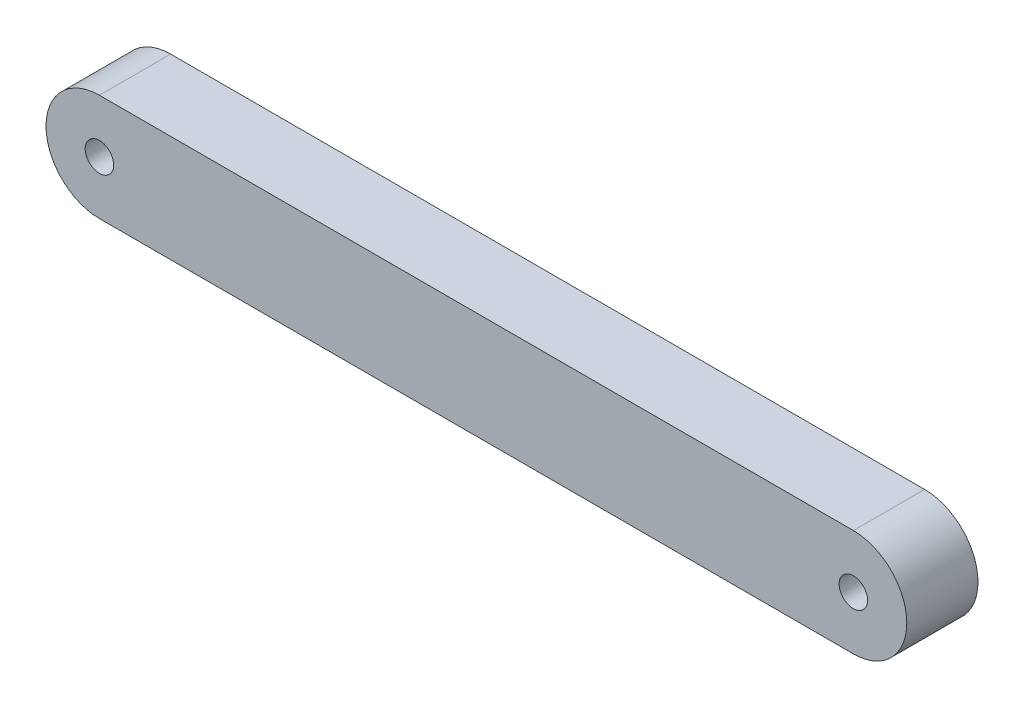
ISO-10303-21;
HEADER;
FILE_DESCRIPTION(('STEP AP214'),'2;1');
FILE_NAME('part.step','',(''),(''),'','','');
FILE_SCHEMA(('AUTOMOTIVE_DESIGN { 1 0 10303 214 1 1 1 1 }'));
ENDSEC;
DATA;
#1=APPLICATION_CONTEXT('core data for automotive mechanical design processes');
#2=APPLICATION_PROTOCOL_DEFINITION('international standard','automotive_design',2000,#1);
#3=PRODUCT_CONTEXT('',#1,'mechanical');
#4=PRODUCT('Part','Part','',(#3));
#5=PRODUCT_RELATED_PRODUCT_CATEGORY('part','',(#4));
#6=PRODUCT_DEFINITION_FORMATION('','',#4);
#7=PRODUCT_DEFINITION_CONTEXT('part definition',#1,'design');
#8=PRODUCT_DEFINITION('design','',#6,#7);
#9=PRODUCT_DEFINITION_SHAPE('','',#8);
#10=(LENGTH_UNIT() NAMED_UNIT(*) SI_UNIT(.MILLI.,.METRE.));
#11=(NAMED_UNIT(*) PLANE_ANGLE_UNIT() SI_UNIT($,.RADIAN.));
#12=(NAMED_UNIT(*) SI_UNIT($,.STERADIAN.) SOLID_ANGLE_UNIT());
#13=UNCERTAINTY_MEASURE_WITH_UNIT(LENGTH_MEASURE(1.E-05),#10,'distance_accuracy_value','');
#14=(GEOMETRIC_REPRESENTATION_CONTEXT(3) GLOBAL_UNCERTAINTY_ASSIGNED_CONTEXT((#13)) GLOBAL_UNIT_ASSIGNED_CONTEXT((#10,
#11,#12)) REPRESENTATION_CONTEXT('',''));
#15=CARTESIAN_POINT('',(0.,0.,0.));
#16=DIRECTION('',(0.,0.,1.));
#17=DIRECTION('',(1.,0.,0.));
#18=AXIS2_PLACEMENT_3D('',#15,#16,#17);
#19=CARTESIAN_POINT('',(0.,0.,20.));
#20=DIRECTION('',(0.,0.,1.));
#21=DIRECTION('',(1.,0.,0.));
#22=AXIS2_PLACEMENT_3D('',#19,#20,#21);
#23=PLANE('',#22);
#24=CARTESIAN_POINT('',(0.,0.,20.));
#25=DIRECTION('',(0.,0.,1.));
#26=DIRECTION('',(1.,0.,0.));
#27=AXIS2_PLACEMENT_3D('',#24,#25,#26);
#28=CIRCLE('',#27,4.);
#29=CARTESIAN_POINT('',(4.,0.,20.));
#30=VERTEX_POINT('',#29);
#31=EDGE_CURVE('E118',#30,#30,#28,.T.);
#32=ORIENTED_EDGE('',*,*,#31,.F.);
#33=EDGE_LOOP('',(#32));
#34=FACE_BOUND('',#33,.T.);
#35=CARTESIAN_POINT('',(0.,0.,20.));
#36=DIRECTION('',(0.,0.,1.));
#37=DIRECTION('',(1.,0.,0.));
#38=AXIS2_PLACEMENT_3D('',#35,#36,#37);
#39=CIRCLE('',#38,15.);
#40=CARTESIAN_POINT('',(0.,15.,20.));
#41=VERTEX_POINT('',#40);
#42=CARTESIAN_POINT('',(0.,-15.,20.));
#43=VERTEX_POINT('',#42);
#44=EDGE_CURVE('E98',#41,#43,#39,.T.);
#45=ORIENTED_EDGE('',*,*,#44,.T.);
#46=DIRECTION('',(1.,0.,0.));
#47=VECTOR('',#46,1.);
#48=CARTESIAN_POINT('',(0.,-15.,20.));
#49=LINE('',#48,#47);
#50=CARTESIAN_POINT('',(211.7,-15.,20.));
#51=VERTEX_POINT('',#50);
#52=EDGE_CURVE('E93',#43,#51,#49,.T.);
#53=ORIENTED_EDGE('',*,*,#52,.T.);
#54=CARTESIAN_POINT('',(211.7,0.,20.));
#55=DIRECTION('',(0.,0.,1.));
#56=DIRECTION('',(1.,0.,0.));
#57=AXIS2_PLACEMENT_3D('',#54,#55,#56);
#58=CIRCLE('',#57,15.);
#59=CARTESIAN_POINT('',(211.7,15.,20.));
#60=VERTEX_POINT('',#59);
#61=EDGE_CURVE('E96',#51,#60,#58,.T.);
#62=ORIENTED_EDGE('',*,*,#61,.T.);
#63=DIRECTION('',(-1.,0.,0.));
#64=VECTOR('',#63,1.);
#65=CARTESIAN_POINT('',(0.,15.,20.));
#66=LINE('',#65,#64);
#67=EDGE_CURVE('E63',#60,#41,#66,.T.);
#68=ORIENTED_EDGE('',*,*,#67,.T.);
#69=EDGE_LOOP('',(#45,#53,#62,#68));
#70=FACE_BOUND('',#69,.T.);
#71=CARTESIAN_POINT('',(211.7,0.,20.));
#72=DIRECTION('',(0.,0.,1.));
#73=DIRECTION('',(1.,0.,0.));
#74=AXIS2_PLACEMENT_3D('',#71,#72,#73);
#75=CIRCLE('',#74,3.99999999999999);
#76=CARTESIAN_POINT('',(215.7,0.,20.));
#77=VERTEX_POINT('',#76);
#78=EDGE_CURVE('E140',#77,#77,#75,.T.);
#79=ORIENTED_EDGE('',*,*,#78,.F.);
#80=EDGE_LOOP('',(#79));
#81=FACE_BOUND('',#80,.T.);
#82=ADVANCED_FACE('F45',(#34,#70,#81),#23,.T.);
#83=CARTESIAN_POINT('',(0.,0.,0.));
#84=DIRECTION('',(0.,0.,1.));
#85=DIRECTION('',(1.,0.,0.));
#86=AXIS2_PLACEMENT_3D('',#83,#84,#85);
#87=PLANE('',#86);
#88=CARTESIAN_POINT('',(0.,0.,0.));
#89=DIRECTION('',(0.,0.,1.));
#90=DIRECTION('',(1.,0.,0.));
#91=AXIS2_PLACEMENT_3D('',#88,#89,#90);
#92=CIRCLE('',#91,15.);
#93=CARTESIAN_POINT('',(0.,15.,0.));
#94=VERTEX_POINT('',#93);
#95=CARTESIAN_POINT('',(0.,-15.,0.));
#96=VERTEX_POINT('',#95);
#97=EDGE_CURVE('E114',#94,#96,#92,.T.);
#98=ORIENTED_EDGE('',*,*,#97,.F.);
#99=DIRECTION('',(-1.,0.,0.));
#100=VECTOR('',#99,1.);
#101=CARTESIAN_POINT('',(0.,15.,0.));
#102=LINE('',#101,#100);
#103=CARTESIAN_POINT('',(211.7,15.,0.));
#104=VERTEX_POINT('',#103);
#105=EDGE_CURVE('E86',#104,#94,#102,.T.);
#106=ORIENTED_EDGE('',*,*,#105,.F.);
#107=CARTESIAN_POINT('',(211.7,0.,0.));
#108=DIRECTION('',(0.,0.,1.));
#109=DIRECTION('',(1.,0.,0.));
#110=AXIS2_PLACEMENT_3D('',#107,#108,#109);
#111=CIRCLE('',#110,15.);
#112=CARTESIAN_POINT('',(211.7,-15.,0.));
#113=VERTEX_POINT('',#112);
#114=EDGE_CURVE('E80',#113,#104,#111,.T.);
#115=ORIENTED_EDGE('',*,*,#114,.F.);
#116=DIRECTION('',(1.,0.,0.));
#117=VECTOR('',#116,1.);
#118=CARTESIAN_POINT('',(0.,-15.,0.));
#119=LINE('',#118,#117);
#120=EDGE_CURVE('E103',#96,#113,#119,.T.);
#121=ORIENTED_EDGE('',*,*,#120,.F.);
#122=EDGE_LOOP('',(#98,#106,#115,#121));
#123=FACE_BOUND('',#122,.T.);
#124=CARTESIAN_POINT('',(0.,0.,0.));
#125=DIRECTION('',(0.,0.,1.));
#126=DIRECTION('',(1.,0.,0.));
#127=AXIS2_PLACEMENT_3D('',#124,#125,#126);
#128=CIRCLE('',#127,4.);
#129=CARTESIAN_POINT('',(4.,0.,0.));
#130=VERTEX_POINT('',#129);
#131=EDGE_CURVE('E136',#130,#130,#128,.T.);
#132=ORIENTED_EDGE('',*,*,#131,.T.);
#133=EDGE_LOOP('',(#132));
#134=FACE_BOUND('',#133,.T.);
#135=CARTESIAN_POINT('',(211.7,0.,0.));
#136=DIRECTION('',(0.,0.,1.));
#137=DIRECTION('',(1.,0.,0.));
#138=AXIS2_PLACEMENT_3D('',#135,#136,#137);
#139=CIRCLE('',#138,3.99999999999999);
#140=CARTESIAN_POINT('',(215.7,0.,0.));
#141=VERTEX_POINT('',#140);
#142=EDGE_CURVE('E144',#141,#141,#139,.T.);
#143=ORIENTED_EDGE('',*,*,#142,.T.);
#144=EDGE_LOOP('',(#143));
#145=FACE_BOUND('',#144,.T.);
#146=ADVANCED_FACE('F131',(#123,#134,#145),#87,.F.);
#147=CARTESIAN_POINT('',(0.,0.,20.));
#148=DIRECTION('',(0.,0.,-1.));
#149=DIRECTION('',(-1.,0.,0.));
#150=AXIS2_PLACEMENT_3D('',#147,#148,#149);
#151=CYLINDRICAL_SURFACE('',#150,15.);
#152=ORIENTED_EDGE('',*,*,#97,.T.);
#153=DIRECTION('',(0.,0.,-1.));
#154=VECTOR('',#153,1.);
#155=CARTESIAN_POINT('',(0.,-15.,20.));
#156=LINE('',#155,#154);
#157=EDGE_CURVE('E11',#43,#96,#156,.T.);
#158=ORIENTED_EDGE('',*,*,#157,.F.);
#159=ORIENTED_EDGE('',*,*,#44,.F.);
#160=DIRECTION('',(0.,0.,-1.));
#161=VECTOR('',#160,1.);
#162=CARTESIAN_POINT('',(0.,15.,20.));
#163=LINE('',#162,#161);
#164=EDGE_CURVE('E110',#41,#94,#163,.T.);
#165=ORIENTED_EDGE('',*,*,#164,.T.);
#166=EDGE_LOOP('',(#152,#158,#159,#165));
#167=FACE_BOUND('',#166,.T.);
#168=ADVANCED_FACE('F47',(#167),#151,.T.);
#169=CARTESIAN_POINT('',(0.,-15.,20.));
#170=DIRECTION('',(0.,1.,0.));
#171=DIRECTION('',(-1.,0.,0.));
#172=AXIS2_PLACEMENT_3D('',#169,#170,#171);
#173=PLANE('',#172);
#174=ORIENTED_EDGE('',*,*,#120,.T.);
#175=DIRECTION('',(0.,0.,-1.));
#176=VECTOR('',#175,1.);
#177=CARTESIAN_POINT('',(211.7,-15.,20.));
#178=LINE('',#177,#176);
#179=EDGE_CURVE('E55',#51,#113,#178,.T.);
#180=ORIENTED_EDGE('',*,*,#179,.F.);
#181=ORIENTED_EDGE('',*,*,#52,.F.);
#182=ORIENTED_EDGE('',*,*,#157,.T.);
#183=EDGE_LOOP('',(#174,#180,#181,#182));
#184=FACE_BOUND('',#183,.T.);
#185=ADVANCED_FACE('F102',(#184),#173,.F.);
#186=CARTESIAN_POINT('',(211.7,0.,20.));
#187=DIRECTION('',(0.,0.,-1.));
#188=DIRECTION('',(-1.,0.,0.));
#189=AXIS2_PLACEMENT_3D('',#186,#187,#188);
#190=CYLINDRICAL_SURFACE('',#189,15.);
#191=ORIENTED_EDGE('',*,*,#114,.T.);
#192=DIRECTION('',(0.,0.,-1.));
#193=VECTOR('',#192,1.);
#194=CARTESIAN_POINT('',(211.7,15.,20.));
#195=LINE('',#194,#193);
#196=EDGE_CURVE('E105',#60,#104,#195,.T.);
#197=ORIENTED_EDGE('',*,*,#196,.F.);
#198=ORIENTED_EDGE('',*,*,#61,.F.);
#199=ORIENTED_EDGE('',*,*,#179,.T.);
#200=EDGE_LOOP('',(#191,#197,#198,#199));
#201=FACE_BOUND('',#200,.T.);
#202=ADVANCED_FACE('F106',(#201),#190,.T.);
#203=CARTESIAN_POINT('',(0.,15.,20.));
#204=DIRECTION('',(0.,-1.,0.));
#205=DIRECTION('',(1.,0.,0.));
#206=AXIS2_PLACEMENT_3D('',#203,#204,#205);
#207=PLANE('',#206);
#208=ORIENTED_EDGE('',*,*,#105,.T.);
#209=ORIENTED_EDGE('',*,*,#164,.F.);
#210=ORIENTED_EDGE('',*,*,#67,.F.);
#211=ORIENTED_EDGE('',*,*,#196,.T.);
#212=EDGE_LOOP('',(#208,#209,#210,#211));
#213=FACE_BOUND('',#212,.T.);
#214=ADVANCED_FACE('F128',(#213),#207,.F.);
#215=CARTESIAN_POINT('',(0.,0.,20.));
#216=DIRECTION('',(0.,0.,-1.));
#217=DIRECTION('',(-1.,0.,0.));
#218=AXIS2_PLACEMENT_3D('',#215,#216,#217);
#219=CYLINDRICAL_SURFACE('',#218,4.);
#220=ORIENTED_EDGE('',*,*,#31,.T.);
#221=EDGE_LOOP('',(#220));
#222=FACE_BOUND('',#221,.T.);
#223=ORIENTED_EDGE('',*,*,#131,.F.);
#224=EDGE_LOOP('',(#223));
#225=FACE_BOUND('',#224,.T.);
#226=ADVANCED_FACE('F163',(#222,#225),#219,.F.);
#227=CARTESIAN_POINT('',(211.7,0.,20.));
#228=DIRECTION('',(0.,0.,-1.));
#229=DIRECTION('',(-1.,0.,0.));
#230=AXIS2_PLACEMENT_3D('',#227,#228,#229);
#231=CYLINDRICAL_SURFACE('',#230,3.99999999999999);
#232=ORIENTED_EDGE('',*,*,#78,.T.);
#233=EDGE_LOOP('',(#232));
#234=FACE_BOUND('',#233,.T.);
#235=ORIENTED_EDGE('',*,*,#142,.F.);
#236=EDGE_LOOP('',(#235));
#237=FACE_BOUND('',#236,.T.);
#238=ADVANCED_FACE('F152',(#234,#237),#231,.F.);
#239=CLOSED_SHELL('',(#82,#146,#168,#185,#202,#214,#226,#238));
#240=MANIFOLD_SOLID_BREP('B2',#239);
#241=ADVANCED_BREP_SHAPE_REPRESENTATION('',(#18,#240),#14);
#242=SHAPE_DEFINITION_REPRESENTATION(#9,#241);
ENDSEC;
END-ISO-10303-21;
